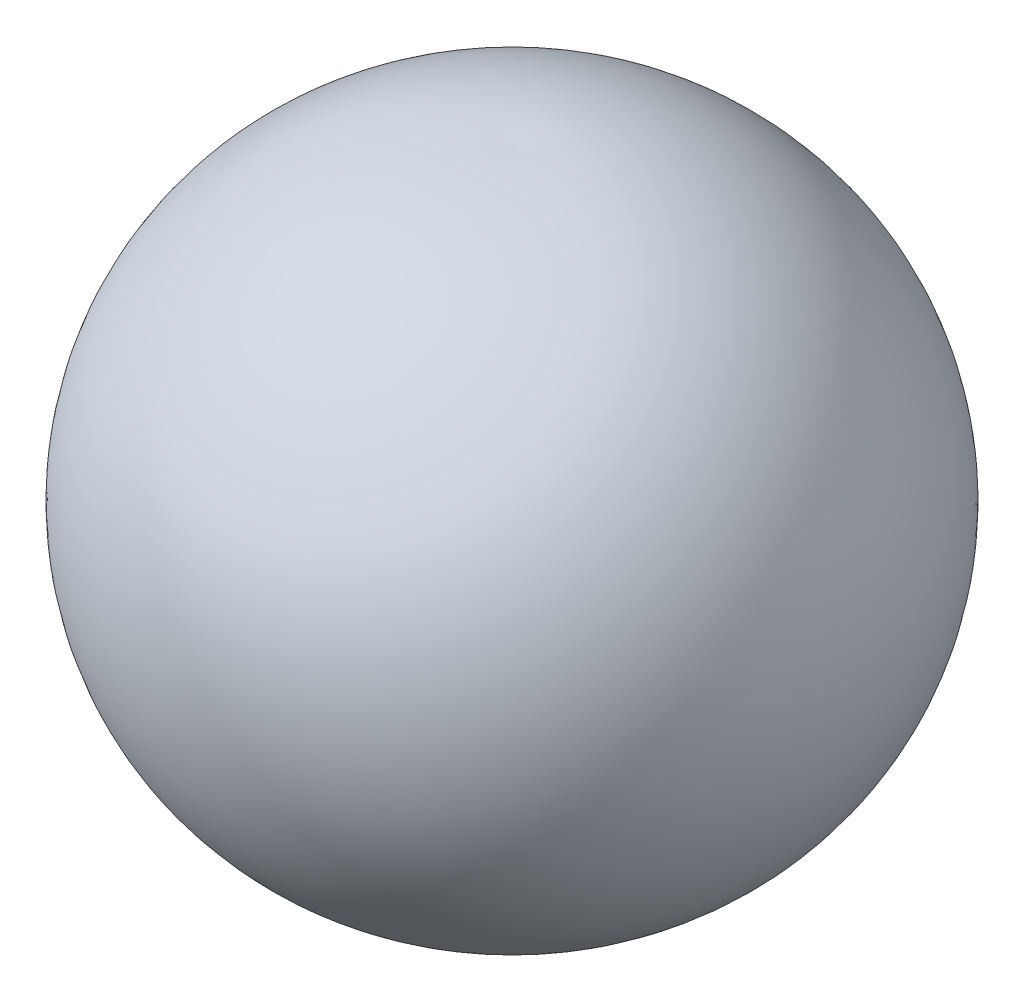
ISO-10303-21;
HEADER;
FILE_DESCRIPTION(('STEP AP214'),'2;1');
FILE_NAME('part.step','',(''),(''),'','','');
FILE_SCHEMA(('AUTOMOTIVE_DESIGN { 1 0 10303 214 1 1 1 1 }'));
ENDSEC;
DATA;
#1=APPLICATION_CONTEXT('core data for automotive mechanical design processes');
#2=APPLICATION_PROTOCOL_DEFINITION('international standard','automotive_design',2000,#1);
#3=PRODUCT_CONTEXT('',#1,'mechanical');
#4=PRODUCT('Part','Part','',(#3));
#5=PRODUCT_RELATED_PRODUCT_CATEGORY('part','',(#4));
#6=PRODUCT_DEFINITION_FORMATION('','',#4);
#7=PRODUCT_DEFINITION_CONTEXT('part definition',#1,'design');
#8=PRODUCT_DEFINITION('design','',#6,#7);
#9=PRODUCT_DEFINITION_SHAPE('','',#8);
#10=(LENGTH_UNIT() NAMED_UNIT(*) SI_UNIT(.MILLI.,.METRE.));
#11=(NAMED_UNIT(*) PLANE_ANGLE_UNIT() SI_UNIT($,.RADIAN.));
#12=(NAMED_UNIT(*) SI_UNIT($,.STERADIAN.) SOLID_ANGLE_UNIT());
#13=UNCERTAINTY_MEASURE_WITH_UNIT(LENGTH_MEASURE(1.E-05),#10,'distance_accuracy_value','');
#14=(GEOMETRIC_REPRESENTATION_CONTEXT(3) GLOBAL_UNCERTAINTY_ASSIGNED_CONTEXT((#13)) GLOBAL_UNIT_ASSIGNED_CONTEXT((#10,
#11,#12)) REPRESENTATION_CONTEXT('',''));
#15=CARTESIAN_POINT('',(0.,0.,0.));
#16=DIRECTION('',(0.,0.,1.));
#17=DIRECTION('',(1.,0.,0.));
#18=AXIS2_PLACEMENT_3D('',#15,#16,#17);
#19=CARTESIAN_POINT('',(0.,9.5,-0.616765757804358));
#20=DIRECTION('',(-1.,0.,0.));
#21=DIRECTION('',(0.,0.,-1.));
#22=AXIS2_PLACEMENT_3D('',#19,#20,#21);
#23=CIRCLE('',#22,9.52);
#24=TRIMMED_CURVE('',#23,(PARAMETER_VALUE(-1.635628052622)),(PARAMETER_VALUE(1.635628052622)),
.T.,.PARAMETER.);
#25=CARTESIAN_POINT('',(0.,9.5,0.));
#26=DIRECTION('',(0.,-1.,0.));
#27=AXIS1_PLACEMENT('',#25,#26);
#28=SURFACE_OF_REVOLUTION('',#24,#27);
#29=CARTESIAN_POINT('',(0.,0.,0.));
#30=VERTEX_POINT('',#29);
#31=VERTEX_LOOP('',#30);
#32=FACE_BOUND('',#31,.T.);
#33=CARTESIAN_POINT('',(0.,19.,0.));
#34=VERTEX_POINT('',#33);
#35=VERTEX_LOOP('',#34);
#36=FACE_BOUND('',#35,.T.);
#37=ADVANCED_FACE('F28',(#32,#36),#28,.T.);
#38=CLOSED_SHELL('',(#37));
#39=MANIFOLD_SOLID_BREP('B2',#38);
#40=ADVANCED_BREP_SHAPE_REPRESENTATION('',(#18,#39),#14);
#41=SHAPE_DEFINITION_REPRESENTATION(#9,#40);
ENDSEC;
END-ISO-10303-21;
